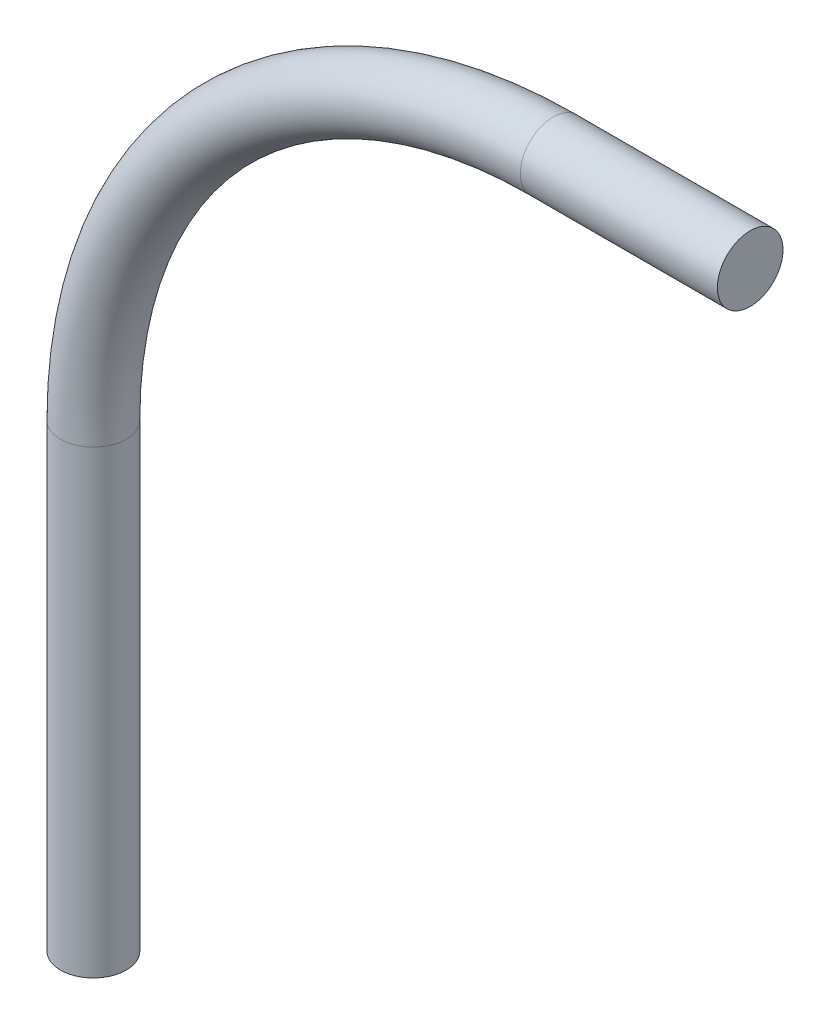
ISO-10303-21;
HEADER;
FILE_DESCRIPTION(('STEP AP214'),'2;1');
FILE_NAME('part.step','',(''),(''),'','','');
FILE_SCHEMA(('AUTOMOTIVE_DESIGN { 1 0 10303 214 1 1 1 1 }'));
ENDSEC;
DATA;
#1=APPLICATION_CONTEXT('core data for automotive mechanical design processes');
#2=APPLICATION_PROTOCOL_DEFINITION('international standard','automotive_design',2000,#1);
#3=PRODUCT_CONTEXT('',#1,'mechanical');
#4=PRODUCT('Part','Part','',(#3));
#5=PRODUCT_RELATED_PRODUCT_CATEGORY('part','',(#4));
#6=PRODUCT_DEFINITION_FORMATION('','',#4);
#7=PRODUCT_DEFINITION_CONTEXT('part definition',#1,'design');
#8=PRODUCT_DEFINITION('design','',#6,#7);
#9=PRODUCT_DEFINITION_SHAPE('','',#8);
#10=(LENGTH_UNIT() NAMED_UNIT(*) SI_UNIT(.MILLI.,.METRE.));
#11=(NAMED_UNIT(*) PLANE_ANGLE_UNIT() SI_UNIT($,.RADIAN.));
#12=(NAMED_UNIT(*) SI_UNIT($,.STERADIAN.) SOLID_ANGLE_UNIT());
#13=UNCERTAINTY_MEASURE_WITH_UNIT(LENGTH_MEASURE(1.E-05),#10,'distance_accuracy_value','');
#14=(GEOMETRIC_REPRESENTATION_CONTEXT(3) GLOBAL_UNCERTAINTY_ASSIGNED_CONTEXT((#13)) GLOBAL_UNIT_ASSIGNED_CONTEXT((#10,
#11,#12)) REPRESENTATION_CONTEXT('',''));
#15=CARTESIAN_POINT('',(0.,0.,0.));
#16=DIRECTION('',(0.,0.,1.));
#17=DIRECTION('',(1.,0.,0.));
#18=AXIS2_PLACEMENT_3D('',#15,#16,#17);
#19=CARTESIAN_POINT('',(0.,0.,0.));
#20=DIRECTION('',(0.,1.,0.));
#21=DIRECTION('',(0.,0.,1.));
#22=AXIS2_PLACEMENT_3D('',#19,#20,#21);
#23=PLANE('',#22);
#24=CARTESIAN_POINT('',(0.,0.,0.));
#25=DIRECTION('',(0.,1.,0.));
#26=DIRECTION('',(0.,0.,1.));
#27=AXIS2_PLACEMENT_3D('',#24,#25,#26);
#28=CIRCLE('',#27,2.5);
#29=CARTESIAN_POINT('',(0.,0.,2.5));
#30=VERTEX_POINT('',#29);
#31=EDGE_CURVE('E58',#30,#30,#28,.T.);
#32=ORIENTED_EDGE('',*,*,#31,.F.);
#33=EDGE_LOOP('',(#32));
#34=FACE_BOUND('',#33,.T.);
#35=ADVANCED_FACE('F41',(#34),#23,.F.);
#36=CARTESIAN_POINT('',(50.,70.,0.));
#37=DIRECTION('',(1.,0.,0.));
#38=DIRECTION('',(0.,0.,1.));
#39=AXIS2_PLACEMENT_3D('',#36,#37,#38);
#40=PLANE('',#39);
#41=CARTESIAN_POINT('',(50.,70.,0.));
#42=DIRECTION('',(1.,0.,0.));
#43=DIRECTION('',(0.,0.,1.));
#44=AXIS2_PLACEMENT_3D('',#41,#42,#43);
#45=CIRCLE('',#44,2.5);
#46=CARTESIAN_POINT('',(50.,70.,2.5));
#47=VERTEX_POINT('',#46);
#48=EDGE_CURVE('E10',#47,#47,#45,.T.);
#49=ORIENTED_EDGE('',*,*,#48,.T.);
#50=EDGE_LOOP('',(#49));
#51=FACE_BOUND('',#50,.T.);
#52=ADVANCED_FACE('F68',(#51),#40,.T.);
#53=CARTESIAN_POINT('',(0.,0.,0.));
#54=DIRECTION('',(0.,1.,0.));
#55=DIRECTION('',(0.,0.,1.));
#56=AXIS2_PLACEMENT_3D('',#53,#54,#55);
#57=CYLINDRICAL_SURFACE('',#56,2.5);
#58=CARTESIAN_POINT('',(0.,35.,0.));
#59=DIRECTION('',(0.,1.,0.));
#60=DIRECTION('',(0.,0.,1.));
#61=AXIS2_PLACEMENT_3D('',#58,#59,#60);
#62=CIRCLE('',#61,2.5);
#63=CARTESIAN_POINT('',(-2.5,35.,0.));
#64=VERTEX_POINT('',#63);
#65=EDGE_CURVE('E53',#64,#64,#62,.T.);
#66=ORIENTED_EDGE('',*,*,#65,.F.);
#67=EDGE_LOOP('',(#66));
#68=FACE_BOUND('',#67,.T.);
#69=ORIENTED_EDGE('',*,*,#31,.T.);
#70=EDGE_LOOP('',(#69));
#71=FACE_BOUND('',#70,.T.);
#72=ADVANCED_FACE('F65',(#68,#71),#57,.T.);
#73=CARTESIAN_POINT('',(35.,35.,0.));
#74=DIRECTION('',(0.,0.,-1.));
#75=DIRECTION('',(-1.,0.,0.));
#76=AXIS2_PLACEMENT_3D('',#73,#74,#75);
#77=TOROIDAL_SURFACE('',#76,35.,2.5);
#78=CARTESIAN_POINT('',(35.,70.,0.));
#79=DIRECTION('',(1.,0.,0.));
#80=DIRECTION('',(0.,0.,1.));
#81=AXIS2_PLACEMENT_3D('',#78,#79,#80);
#82=CIRCLE('',#81,2.5);
#83=CARTESIAN_POINT('',(35.,72.5,0.));
#84=VERTEX_POINT('',#83);
#85=EDGE_CURVE('E48',#84,#84,#82,.T.);
#86=CARTESIAN_POINT('',(35.,35.,0.));
#87=DIRECTION('',(0.,0.,-1.));
#88=DIRECTION('',(-1.,0.,0.));
#89=AXIS2_PLACEMENT_3D('',#86,#87,#88);
#90=CIRCLE('',#89,37.5);
#91=EDGE_CURVE('',#64,#84,#90,.T.);
#92=ORIENTED_EDGE('',*,*,#65,.T.);
#93=ORIENTED_EDGE('',*,*,#85,.F.);
#94=ORIENTED_EDGE('',*,*,#91,.T.);
#95=ORIENTED_EDGE('',*,*,#91,.F.);
#96=EDGE_LOOP('',(#92,#94,#93,#95));
#97=FACE_BOUND('',#96,.T.);
#98=ADVANCED_FACE('F74',(#97),#77,.T.);
#99=CARTESIAN_POINT('',(35.,70.,0.));
#100=DIRECTION('',(1.,0.,0.));
#101=DIRECTION('',(0.,0.,-1.));
#102=AXIS2_PLACEMENT_3D('',#99,#100,#101);
#103=CYLINDRICAL_SURFACE('',#102,2.5);
#104=ORIENTED_EDGE('',*,*,#48,.F.);
#105=EDGE_LOOP('',(#104));
#106=FACE_BOUND('',#105,.T.);
#107=ORIENTED_EDGE('',*,*,#85,.T.);
#108=EDGE_LOOP('',(#107));
#109=FACE_BOUND('',#108,.T.);
#110=ADVANCED_FACE('F72',(#106,#109),#103,.T.);
#111=CLOSED_SHELL('',(#35,#52,#72,#98,#110));
#112=MANIFOLD_SOLID_BREP('B2',#111);
#113=ADVANCED_BREP_SHAPE_REPRESENTATION('',(#18,#112),#14);
#114=SHAPE_DEFINITION_REPRESENTATION(#9,#113);
ENDSEC;
END-ISO-10303-21;
